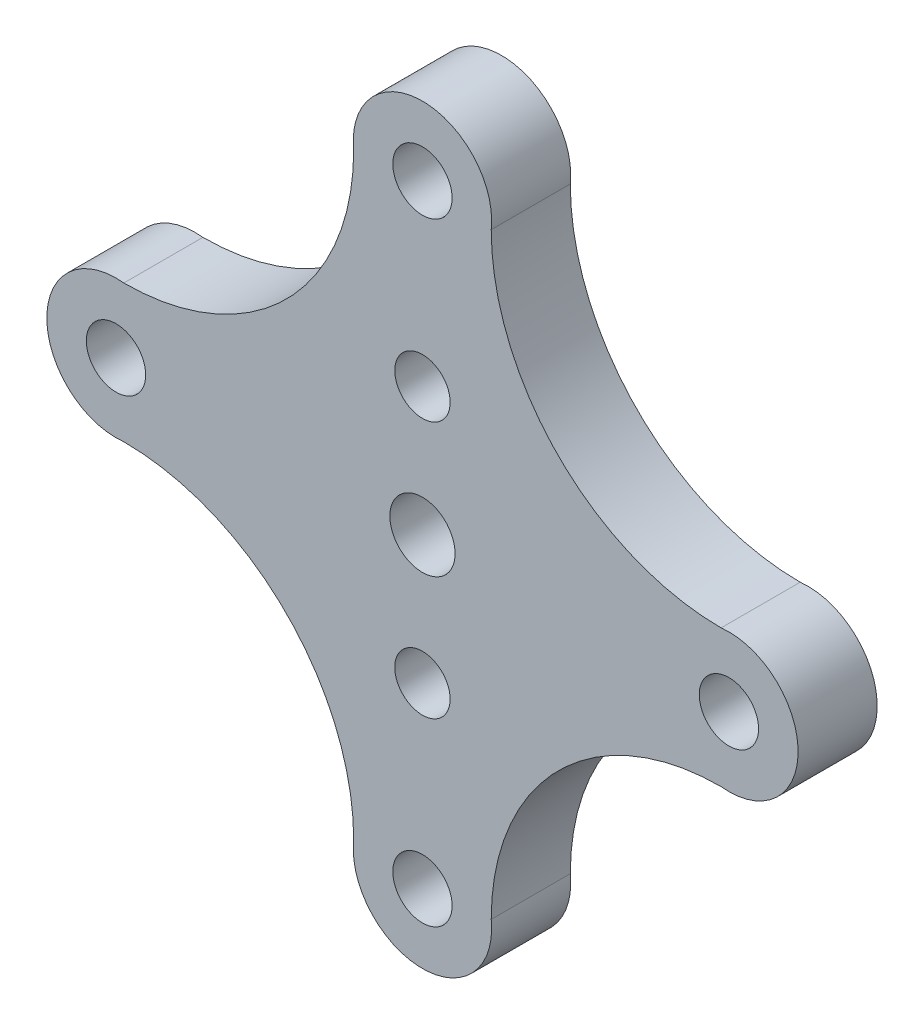
ISO-10303-21;
HEADER;
FILE_DESCRIPTION(('STEP AP214'),'2;1');
FILE_NAME('part.step','',(''),(''),'','','');
FILE_SCHEMA(('AUTOMOTIVE_DESIGN { 1 0 10303 214 1 1 1 1 }'));
ENDSEC;
DATA;
#1=APPLICATION_CONTEXT('core data for automotive mechanical design processes');
#2=APPLICATION_PROTOCOL_DEFINITION('international standard','automotive_design',2000,#1);
#3=PRODUCT_CONTEXT('',#1,'mechanical');
#4=PRODUCT('Part','Part','',(#3));
#5=PRODUCT_RELATED_PRODUCT_CATEGORY('part','',(#4));
#6=PRODUCT_DEFINITION_FORMATION('','',#4);
#7=PRODUCT_DEFINITION_CONTEXT('part definition',#1,'design');
#8=PRODUCT_DEFINITION('design','',#6,#7);
#9=PRODUCT_DEFINITION_SHAPE('','',#8);
#10=(LENGTH_UNIT() NAMED_UNIT(*) SI_UNIT(.MILLI.,.METRE.));
#11=(NAMED_UNIT(*) PLANE_ANGLE_UNIT() SI_UNIT($,.RADIAN.));
#12=(NAMED_UNIT(*) SI_UNIT($,.STERADIAN.) SOLID_ANGLE_UNIT());
#13=UNCERTAINTY_MEASURE_WITH_UNIT(LENGTH_MEASURE(1.E-05),#10,'distance_accuracy_value','');
#14=(GEOMETRIC_REPRESENTATION_CONTEXT(3) GLOBAL_UNCERTAINTY_ASSIGNED_CONTEXT((#13)) GLOBAL_UNIT_ASSIGNED_CONTEXT((#10,
#11,#12)) REPRESENTATION_CONTEXT('',''));
#15=CARTESIAN_POINT('',(0.,0.,0.));
#16=DIRECTION('',(0.,0.,1.));
#17=DIRECTION('',(1.,0.,0.));
#18=AXIS2_PLACEMENT_3D('',#15,#16,#17);
#19=CARTESIAN_POINT('',(-7.55241935483874,-15.3024193548387,4.));
#20=DIRECTION('',(0.,0.,-1.));
#21=DIRECTION('',(-1.,0.,0.));
#22=AXIS2_PLACEMENT_3D('',#19,#20,#21);
#23=PLANE('',#22);
#24=CARTESIAN_POINT('',(-15.1048387096775,-15.1048387096775,4.));
#25=DIRECTION('',(0.,0.,-1.));
#26=DIRECTION('',(-1.,0.,0.));
#27=AXIS2_PLACEMENT_3D('',#24,#25,#26);
#28=CIRCLE('',#27,11.6272177477798);
#29=CARTESIAN_POINT('',(-15.1048387096774,-3.4776209618977,4.));
#30=VERTEX_POINT('',#29);
#31=CARTESIAN_POINT('',(-3.47762096189774,-15.1048387096774,4.));
#32=VERTEX_POINT('',#31);
#33=EDGE_CURVE('E164',#30,#32,#28,.T.);
#34=ORIENTED_EDGE('',*,*,#33,.T.);
#35=CARTESIAN_POINT('',(0.,-15.5,4.));
#36=DIRECTION('',(0.,0.,1.));
#37=DIRECTION('',(1.,0.,0.));
#38=AXIS2_PLACEMENT_3D('',#35,#36,#37);
#39=CIRCLE('',#38,3.5);
#40=CARTESIAN_POINT('',(3.47762096189774,-15.1048387096774,4.));
#41=VERTEX_POINT('',#40);
#42=EDGE_CURVE('E100',#32,#41,#39,.T.);
#43=ORIENTED_EDGE('',*,*,#42,.T.);
#44=CARTESIAN_POINT('',(15.1048387096773,-15.1048387096775,4.));
#45=DIRECTION('',(0.,0.,-1.));
#46=DIRECTION('',(1.,0.,0.));
#47=AXIS2_PLACEMENT_3D('',#44,#45,#46);
#48=CIRCLE('',#47,11.6272177477796);
#49=CARTESIAN_POINT('',(15.1048387096774,-3.4776209618979,4.));
#50=VERTEX_POINT('',#49);
#51=EDGE_CURVE('E185',#41,#50,#48,.T.);
#52=ORIENTED_EDGE('',*,*,#51,.T.);
#53=CARTESIAN_POINT('',(15.5,-1.62353882256206E-13,4.));
#54=DIRECTION('',(0.,0.,1.));
#55=DIRECTION('',(1.,0.,0.));
#56=AXIS2_PLACEMENT_3D('',#53,#54,#55);
#57=CIRCLE('',#56,3.5);
#58=CARTESIAN_POINT('',(15.1048387096775,3.47762096189759,4.));
#59=VERTEX_POINT('',#58);
#60=EDGE_CURVE('E199',#50,#59,#57,.T.);
#61=ORIENTED_EDGE('',*,*,#60,.T.);
#62=CARTESIAN_POINT('',(15.104838709678,15.104838709678,4.));
#63=DIRECTION('',(0.,0.,-1.));
#64=DIRECTION('',(1.,0.,0.));
#65=AXIS2_PLACEMENT_3D('',#62,#63,#64);
#66=CIRCLE('',#65,11.6272177477803);
#67=CARTESIAN_POINT('',(3.47762096189772,15.1048387096777,4.));
#68=VERTEX_POINT('',#67);
#69=EDGE_CURVE('E119',#59,#68,#66,.T.);
#70=ORIENTED_EDGE('',*,*,#69,.T.);
#71=CARTESIAN_POINT('',(0.,15.5000000000002,4.));
#72=DIRECTION('',(0.,0.,1.));
#73=DIRECTION('',(1.,0.,0.));
#74=AXIS2_PLACEMENT_3D('',#71,#72,#73);
#75=CIRCLE('',#74,3.5);
#76=CARTESIAN_POINT('',(-3.47762096189766,15.1048387096777,4.));
#77=VERTEX_POINT('',#76);
#78=EDGE_CURVE('E113',#68,#77,#75,.T.);
#79=ORIENTED_EDGE('',*,*,#78,.T.);
#80=CARTESIAN_POINT('',(-15.1048387096774,15.1048387096776,4.));
#81=DIRECTION('',(0.,0.,-1.));
#82=DIRECTION('',(1.,0.,0.));
#83=AXIS2_PLACEMENT_3D('',#80,#81,#82);
#84=CIRCLE('',#83,11.6272177477798);
#85=CARTESIAN_POINT('',(-15.1048387096774,3.47762096189785,4.));
#86=VERTEX_POINT('',#85);
#87=EDGE_CURVE('E117',#77,#86,#84,.T.);
#88=ORIENTED_EDGE('',*,*,#87,.T.);
#89=CARTESIAN_POINT('',(-15.5,0.,4.));
#90=DIRECTION('',(0.,0.,1.));
#91=DIRECTION('',(1.,0.,0.));
#92=AXIS2_PLACEMENT_3D('',#89,#90,#91);
#93=CIRCLE('',#92,3.5);
#94=EDGE_CURVE('E57',#86,#30,#93,.T.);
#95=ORIENTED_EDGE('',*,*,#94,.T.);
#96=EDGE_LOOP('',(#34,#43,#52,#61,#70,#79,#88,#95));
#97=FACE_BOUND('',#96,.T.);
#98=CARTESIAN_POINT('',(0.,0.,4.));
#99=DIRECTION('',(0.,0.,1.));
#100=DIRECTION('',(1.,0.,0.));
#101=AXIS2_PLACEMENT_3D('',#98,#99,#100);
#102=CIRCLE('',#101,1.65);
#103=CARTESIAN_POINT('',(1.65,0.,4.));
#104=VERTEX_POINT('',#103);
#105=EDGE_CURVE('E146',#104,#104,#102,.T.);
#106=ORIENTED_EDGE('',*,*,#105,.F.);
#107=EDGE_LOOP('',(#106));
#108=FACE_BOUND('',#107,.T.);
#109=CARTESIAN_POINT('',(0.,-6.5,4.));
#110=DIRECTION('',(0.,0.,1.));
#111=DIRECTION('',(1.,0.,0.));
#112=AXIS2_PLACEMENT_3D('',#109,#110,#111);
#113=CIRCLE('',#112,1.4);
#114=CARTESIAN_POINT('',(1.4,-6.5,4.));
#115=VERTEX_POINT('',#114);
#116=EDGE_CURVE('E213',#115,#115,#113,.T.);
#117=ORIENTED_EDGE('',*,*,#116,.F.);
#118=EDGE_LOOP('',(#117));
#119=FACE_BOUND('',#118,.T.);
#120=CARTESIAN_POINT('',(0.,-15.5,4.));
#121=DIRECTION('',(0.,0.,1.));
#122=DIRECTION('',(1.,0.,0.));
#123=AXIS2_PLACEMENT_3D('',#120,#121,#122);
#124=CIRCLE('',#123,1.5);
#125=CARTESIAN_POINT('',(1.5,-15.5,4.));
#126=VERTEX_POINT('',#125);
#127=EDGE_CURVE('E221',#126,#126,#124,.T.);
#128=ORIENTED_EDGE('',*,*,#127,.F.);
#129=EDGE_LOOP('',(#128));
#130=FACE_BOUND('',#129,.T.);
#131=CARTESIAN_POINT('',(0.,6.5,4.));
#132=DIRECTION('',(0.,0.,1.));
#133=DIRECTION('',(1.,0.,0.));
#134=AXIS2_PLACEMENT_3D('',#131,#132,#133);
#135=CIRCLE('',#134,1.4);
#136=CARTESIAN_POINT('',(1.40000000000005,6.5,4.));
#137=VERTEX_POINT('',#136);
#138=EDGE_CURVE('E229',#137,#137,#135,.T.);
#139=ORIENTED_EDGE('',*,*,#138,.F.);
#140=EDGE_LOOP('',(#139));
#141=FACE_BOUND('',#140,.T.);
#142=CARTESIAN_POINT('',(-15.5,0.,4.));
#143=DIRECTION('',(0.,0.,1.));
#144=DIRECTION('',(1.,0.,0.));
#145=AXIS2_PLACEMENT_3D('',#142,#143,#144);
#146=CIRCLE('',#145,1.5);
#147=CARTESIAN_POINT('',(-14.,0.,4.));
#148=VERTEX_POINT('',#147);
#149=EDGE_CURVE('E237',#148,#148,#146,.T.);
#150=ORIENTED_EDGE('',*,*,#149,.F.);
#151=EDGE_LOOP('',(#150));
#152=FACE_BOUND('',#151,.T.);
#153=CARTESIAN_POINT('',(1.08235921504137E-13,15.5,4.));
#154=DIRECTION('',(0.,0.,1.));
#155=DIRECTION('',(1.,0.,0.));
#156=AXIS2_PLACEMENT_3D('',#153,#154,#155);
#157=CIRCLE('',#156,1.5);
#158=CARTESIAN_POINT('',(1.50000000000011,15.5,4.));
#159=VERTEX_POINT('',#158);
#160=EDGE_CURVE('E245',#159,#159,#157,.T.);
#161=ORIENTED_EDGE('',*,*,#160,.F.);
#162=EDGE_LOOP('',(#161));
#163=FACE_BOUND('',#162,.T.);
#164=CARTESIAN_POINT('',(15.5,-1.62353882256206E-13,4.));
#165=DIRECTION('',(0.,0.,1.));
#166=DIRECTION('',(1.,0.,0.));
#167=AXIS2_PLACEMENT_3D('',#164,#165,#166);
#168=CIRCLE('',#167,1.5);
#169=CARTESIAN_POINT('',(17.,-1.62353882256206E-13,4.));
#170=VERTEX_POINT('',#169);
#171=EDGE_CURVE('E253',#170,#170,#168,.T.);
#172=ORIENTED_EDGE('',*,*,#171,.F.);
#173=EDGE_LOOP('',(#172));
#174=FACE_BOUND('',#173,.T.);
#175=ADVANCED_FACE('F39',(#97,#108,#119,#130,#141,#152,#163,#174),#23,.F.);
#176=CARTESIAN_POINT('',(-7.55241935483874,-15.3024193548387,0.));
#177=DIRECTION('',(0.,0.,-1.));
#178=DIRECTION('',(-1.,0.,0.));
#179=AXIS2_PLACEMENT_3D('',#176,#177,#178);
#180=PLANE('',#179);
#181=CARTESIAN_POINT('',(1.08235921504137E-13,15.5,0.));
#182=DIRECTION('',(0.,0.,1.));
#183=DIRECTION('',(1.,0.,0.));
#184=AXIS2_PLACEMENT_3D('',#181,#182,#183);
#185=CIRCLE('',#184,1.5);
#186=CARTESIAN_POINT('',(1.50000000000011,15.5,0.));
#187=VERTEX_POINT('',#186);
#188=EDGE_CURVE('E249',#187,#187,#185,.T.);
#189=ORIENTED_EDGE('',*,*,#188,.T.);
#190=EDGE_LOOP('',(#189));
#191=FACE_BOUND('',#190,.T.);
#192=CARTESIAN_POINT('',(0.,6.5,0.));
#193=DIRECTION('',(0.,0.,1.));
#194=DIRECTION('',(1.,0.,0.));
#195=AXIS2_PLACEMENT_3D('',#192,#193,#194);
#196=CIRCLE('',#195,1.4);
#197=CARTESIAN_POINT('',(1.40000000000005,6.5,0.));
#198=VERTEX_POINT('',#197);
#199=EDGE_CURVE('E233',#198,#198,#196,.T.);
#200=ORIENTED_EDGE('',*,*,#199,.T.);
#201=EDGE_LOOP('',(#200));
#202=FACE_BOUND('',#201,.T.);
#203=CARTESIAN_POINT('',(0.,-6.5,0.));
#204=DIRECTION('',(0.,0.,1.));
#205=DIRECTION('',(1.,0.,0.));
#206=AXIS2_PLACEMENT_3D('',#203,#204,#205);
#207=CIRCLE('',#206,1.4);
#208=CARTESIAN_POINT('',(1.4,-6.5,0.));
#209=VERTEX_POINT('',#208);
#210=EDGE_CURVE('E217',#209,#209,#207,.T.);
#211=ORIENTED_EDGE('',*,*,#210,.T.);
#212=EDGE_LOOP('',(#211));
#213=FACE_BOUND('',#212,.T.);
#214=CARTESIAN_POINT('',(-15.1048387096775,-15.1048387096775,0.));
#215=DIRECTION('',(0.,0.,-1.));
#216=DIRECTION('',(-1.,0.,0.));
#217=AXIS2_PLACEMENT_3D('',#214,#215,#216);
#218=CIRCLE('',#217,11.6272177477798);
#219=CARTESIAN_POINT('',(-15.1048387096774,-3.4776209618977,0.));
#220=VERTEX_POINT('',#219);
#221=CARTESIAN_POINT('',(-3.47762096189774,-15.1048387096774,0.));
#222=VERTEX_POINT('',#221);
#223=EDGE_CURVE('E141',#220,#222,#218,.T.);
#224=ORIENTED_EDGE('',*,*,#223,.F.);
#225=CARTESIAN_POINT('',(-15.5,0.,0.));
#226=DIRECTION('',(0.,0.,1.));
#227=DIRECTION('',(1.,0.,0.));
#228=AXIS2_PLACEMENT_3D('',#225,#226,#227);
#229=CIRCLE('',#228,3.5);
#230=CARTESIAN_POINT('',(-15.1048387096774,3.47762096189785,0.));
#231=VERTEX_POINT('',#230);
#232=EDGE_CURVE('E92',#231,#220,#229,.T.);
#233=ORIENTED_EDGE('',*,*,#232,.F.);
#234=CARTESIAN_POINT('',(-15.1048387096774,15.1048387096776,0.));
#235=DIRECTION('',(0.,0.,-1.));
#236=DIRECTION('',(1.,0.,0.));
#237=AXIS2_PLACEMENT_3D('',#234,#235,#236);
#238=CIRCLE('',#237,11.6272177477798);
#239=CARTESIAN_POINT('',(-3.47762096189766,15.1048387096777,0.));
#240=VERTEX_POINT('',#239);
#241=EDGE_CURVE('E86',#240,#231,#238,.T.);
#242=ORIENTED_EDGE('',*,*,#241,.F.);
#243=CARTESIAN_POINT('',(0.,15.5000000000002,0.));
#244=DIRECTION('',(0.,0.,1.));
#245=DIRECTION('',(1.,0.,0.));
#246=AXIS2_PLACEMENT_3D('',#243,#244,#245);
#247=CIRCLE('',#246,3.5);
#248=CARTESIAN_POINT('',(3.47762096189772,15.1048387096777,0.));
#249=VERTEX_POINT('',#248);
#250=EDGE_CURVE('E128',#249,#240,#247,.T.);
#251=ORIENTED_EDGE('',*,*,#250,.F.);
#252=CARTESIAN_POINT('',(15.104838709678,15.104838709678,0.));
#253=DIRECTION('',(0.,0.,-1.));
#254=DIRECTION('',(1.,0.,0.));
#255=AXIS2_PLACEMENT_3D('',#252,#253,#254);
#256=CIRCLE('',#255,11.6272177477803);
#257=CARTESIAN_POINT('',(15.1048387096775,3.47762096189759,0.));
#258=VERTEX_POINT('',#257);
#259=EDGE_CURVE('E155',#258,#249,#256,.T.);
#260=ORIENTED_EDGE('',*,*,#259,.F.);
#261=CARTESIAN_POINT('',(15.5,-1.62353882256206E-13,0.));
#262=DIRECTION('',(0.,0.,1.));
#263=DIRECTION('',(1.,0.,0.));
#264=AXIS2_PLACEMENT_3D('',#261,#262,#263);
#265=CIRCLE('',#264,3.5);
#266=CARTESIAN_POINT('',(15.1048387096774,-3.4776209618979,0.));
#267=VERTEX_POINT('',#266);
#268=EDGE_CURVE('E152',#267,#258,#265,.T.);
#269=ORIENTED_EDGE('',*,*,#268,.F.);
#270=CARTESIAN_POINT('',(15.1048387096773,-15.1048387096775,0.));
#271=DIRECTION('',(0.,0.,-1.));
#272=DIRECTION('',(1.,0.,0.));
#273=AXIS2_PLACEMENT_3D('',#270,#271,#272);
#274=CIRCLE('',#273,11.6272177477796);
#275=CARTESIAN_POINT('',(3.47762096189774,-15.1048387096774,0.));
#276=VERTEX_POINT('',#275);
#277=EDGE_CURVE('E149',#276,#267,#274,.T.);
#278=ORIENTED_EDGE('',*,*,#277,.F.);
#279=CARTESIAN_POINT('',(0.,-15.5,0.));
#280=DIRECTION('',(0.,0.,1.));
#281=DIRECTION('',(1.,0.,0.));
#282=AXIS2_PLACEMENT_3D('',#279,#280,#281);
#283=CIRCLE('',#282,3.5);
#284=EDGE_CURVE('E145',#222,#276,#283,.T.);
#285=ORIENTED_EDGE('',*,*,#284,.F.);
#286=EDGE_LOOP('',(#224,#233,#242,#251,#260,#269,#278,#285));
#287=FACE_BOUND('',#286,.T.);
#288=CARTESIAN_POINT('',(0.,0.,0.));
#289=DIRECTION('',(0.,0.,1.));
#290=DIRECTION('',(1.,0.,0.));
#291=AXIS2_PLACEMENT_3D('',#288,#289,#290);
#292=CIRCLE('',#291,1.65);
#293=CARTESIAN_POINT('',(1.65,0.,0.));
#294=VERTEX_POINT('',#293);
#295=EDGE_CURVE('E209',#294,#294,#292,.T.);
#296=ORIENTED_EDGE('',*,*,#295,.T.);
#297=EDGE_LOOP('',(#296));
#298=FACE_BOUND('',#297,.T.);
#299=CARTESIAN_POINT('',(0.,-15.5,0.));
#300=DIRECTION('',(0.,0.,1.));
#301=DIRECTION('',(1.,0.,0.));
#302=AXIS2_PLACEMENT_3D('',#299,#300,#301);
#303=CIRCLE('',#302,1.5);
#304=CARTESIAN_POINT('',(1.5,-15.5,0.));
#305=VERTEX_POINT('',#304);
#306=EDGE_CURVE('E225',#305,#305,#303,.T.);
#307=ORIENTED_EDGE('',*,*,#306,.T.);
#308=EDGE_LOOP('',(#307));
#309=FACE_BOUND('',#308,.T.);
#310=CARTESIAN_POINT('',(-15.5,0.,0.));
#311=DIRECTION('',(0.,0.,1.));
#312=DIRECTION('',(1.,0.,0.));
#313=AXIS2_PLACEMENT_3D('',#310,#311,#312);
#314=CIRCLE('',#313,1.5);
#315=CARTESIAN_POINT('',(-14.,0.,0.));
#316=VERTEX_POINT('',#315);
#317=EDGE_CURVE('E241',#316,#316,#314,.T.);
#318=ORIENTED_EDGE('',*,*,#317,.T.);
#319=EDGE_LOOP('',(#318));
#320=FACE_BOUND('',#319,.T.);
#321=CARTESIAN_POINT('',(15.5,-1.62353882256206E-13,0.));
#322=DIRECTION('',(0.,0.,1.));
#323=DIRECTION('',(1.,0.,0.));
#324=AXIS2_PLACEMENT_3D('',#321,#322,#323);
#325=CIRCLE('',#324,1.5);
#326=CARTESIAN_POINT('',(17.,-1.62353882256206E-13,0.));
#327=VERTEX_POINT('',#326);
#328=EDGE_CURVE('E257',#327,#327,#325,.T.);
#329=ORIENTED_EDGE('',*,*,#328,.T.);
#330=EDGE_LOOP('',(#329));
#331=FACE_BOUND('',#330,.T.);
#332=ADVANCED_FACE('F189',(#191,#202,#213,#287,#298,#309,#320,#331),#180,.T.);
#333=CARTESIAN_POINT('',(-15.1048387096775,-15.1048387096775,4.));
#334=DIRECTION('',(0.,0.,-1.));
#335=DIRECTION('',(-1.,0.,0.));
#336=AXIS2_PLACEMENT_3D('',#333,#334,#335);
#337=CYLINDRICAL_SURFACE('',#336,11.6272177477798);
#338=ORIENTED_EDGE('',*,*,#223,.T.);
#339=DIRECTION('',(0.,0.,-1.));
#340=VECTOR('',#339,1.);
#341=CARTESIAN_POINT('',(-3.47762096189774,-15.1048387096774,4.));
#342=LINE('',#341,#340);
#343=EDGE_CURVE('E11',#32,#222,#342,.T.);
#344=ORIENTED_EDGE('',*,*,#343,.F.);
#345=ORIENTED_EDGE('',*,*,#33,.F.);
#346=DIRECTION('',(0.,0.,-1.));
#347=VECTOR('',#346,1.);
#348=CARTESIAN_POINT('',(-15.1048387096774,-3.4776209618977,4.));
#349=LINE('',#348,#347);
#350=EDGE_CURVE('E137',#30,#220,#349,.T.);
#351=ORIENTED_EDGE('',*,*,#350,.T.);
#352=EDGE_LOOP('',(#338,#344,#345,#351));
#353=FACE_BOUND('',#352,.T.);
#354=ADVANCED_FACE('F41',(#353),#337,.F.);
#355=CARTESIAN_POINT('',(0.,-15.5,4.));
#356=DIRECTION('',(0.,0.,-1.));
#357=DIRECTION('',(-1.,0.,0.));
#358=AXIS2_PLACEMENT_3D('',#355,#356,#357);
#359=CYLINDRICAL_SURFACE('',#358,3.5);
#360=ORIENTED_EDGE('',*,*,#284,.T.);
#361=DIRECTION('',(0.,0.,-1.));
#362=VECTOR('',#361,1.);
#363=CARTESIAN_POINT('',(3.47762096189774,-15.1048387096774,4.));
#364=LINE('',#363,#362);
#365=EDGE_CURVE('E49',#41,#276,#364,.T.);
#366=ORIENTED_EDGE('',*,*,#365,.F.);
#367=ORIENTED_EDGE('',*,*,#42,.F.);
#368=ORIENTED_EDGE('',*,*,#343,.T.);
#369=EDGE_LOOP('',(#360,#366,#367,#368));
#370=FACE_BOUND('',#369,.T.);
#371=ADVANCED_FACE('F291',(#370),#359,.T.);
#372=CARTESIAN_POINT('',(15.1048387096773,-15.1048387096775,4.));
#373=DIRECTION('',(0.,0.,-1.));
#374=DIRECTION('',(-1.,0.,0.));
#375=AXIS2_PLACEMENT_3D('',#372,#373,#374);
#376=CYLINDRICAL_SURFACE('',#375,11.6272177477796);
#377=ORIENTED_EDGE('',*,*,#277,.T.);
#378=DIRECTION('',(0.,0.,-1.));
#379=VECTOR('',#378,1.);
#380=CARTESIAN_POINT('',(15.1048387096774,-3.4776209618979,4.));
#381=LINE('',#380,#379);
#382=EDGE_CURVE('E175',#50,#267,#381,.T.);
#383=ORIENTED_EDGE('',*,*,#382,.F.);
#384=ORIENTED_EDGE('',*,*,#51,.F.);
#385=ORIENTED_EDGE('',*,*,#365,.T.);
#386=EDGE_LOOP('',(#377,#383,#384,#385));
#387=FACE_BOUND('',#386,.T.);
#388=ADVANCED_FACE('F183',(#387),#376,.F.);
#389=CARTESIAN_POINT('',(15.5,-1.62353882256206E-13,4.));
#390=DIRECTION('',(0.,0.,-1.));
#391=DIRECTION('',(-1.,0.,0.));
#392=AXIS2_PLACEMENT_3D('',#389,#390,#391);
#393=CYLINDRICAL_SURFACE('',#392,3.5);
#394=ORIENTED_EDGE('',*,*,#268,.T.);
#395=DIRECTION('',(0.,0.,-1.));
#396=VECTOR('',#395,1.);
#397=CARTESIAN_POINT('',(15.1048387096775,3.47762096189759,4.));
#398=LINE('',#397,#396);
#399=EDGE_CURVE('E171',#59,#258,#398,.T.);
#400=ORIENTED_EDGE('',*,*,#399,.F.);
#401=ORIENTED_EDGE('',*,*,#60,.F.);
#402=ORIENTED_EDGE('',*,*,#382,.T.);
#403=EDGE_LOOP('',(#394,#400,#401,#402));
#404=FACE_BOUND('',#403,.T.);
#405=ADVANCED_FACE('F194',(#404),#393,.T.);
#406=CARTESIAN_POINT('',(15.104838709678,15.104838709678,4.));
#407=DIRECTION('',(0.,0.,-1.));
#408=DIRECTION('',(-1.,0.,0.));
#409=AXIS2_PLACEMENT_3D('',#406,#407,#408);
#410=CYLINDRICAL_SURFACE('',#409,11.6272177477803);
#411=ORIENTED_EDGE('',*,*,#259,.T.);
#412=DIRECTION('',(0.,0.,-1.));
#413=VECTOR('',#412,1.);
#414=CARTESIAN_POINT('',(3.47762096189772,15.1048387096777,4.));
#415=LINE('',#414,#413);
#416=EDGE_CURVE('E130',#68,#249,#415,.T.);
#417=ORIENTED_EDGE('',*,*,#416,.F.);
#418=ORIENTED_EDGE('',*,*,#69,.F.);
#419=ORIENTED_EDGE('',*,*,#399,.T.);
#420=EDGE_LOOP('',(#411,#417,#418,#419));
#421=FACE_BOUND('',#420,.T.);
#422=ADVANCED_FACE('F197',(#421),#410,.F.);
#423=CARTESIAN_POINT('',(0.,15.5000000000002,4.));
#424=DIRECTION('',(0.,0.,-1.));
#425=DIRECTION('',(-1.,0.,0.));
#426=AXIS2_PLACEMENT_3D('',#423,#424,#425);
#427=CYLINDRICAL_SURFACE('',#426,3.5);
#428=ORIENTED_EDGE('',*,*,#250,.T.);
#429=DIRECTION('',(0.,0.,-1.));
#430=VECTOR('',#429,1.);
#431=CARTESIAN_POINT('',(-3.47762096189766,15.1048387096777,4.));
#432=LINE('',#431,#430);
#433=EDGE_CURVE('E125',#77,#240,#432,.T.);
#434=ORIENTED_EDGE('',*,*,#433,.F.);
#435=ORIENTED_EDGE('',*,*,#78,.F.);
#436=ORIENTED_EDGE('',*,*,#416,.T.);
#437=EDGE_LOOP('',(#428,#434,#435,#436));
#438=FACE_BOUND('',#437,.T.);
#439=ADVANCED_FACE('F126',(#438),#427,.T.);
#440=CARTESIAN_POINT('',(-15.1048387096774,15.1048387096776,4.));
#441=DIRECTION('',(0.,0.,-1.));
#442=DIRECTION('',(-1.,0.,0.));
#443=AXIS2_PLACEMENT_3D('',#440,#441,#442);
#444=CYLINDRICAL_SURFACE('',#443,11.6272177477798);
#445=ORIENTED_EDGE('',*,*,#241,.T.);
#446=DIRECTION('',(0.,0.,-1.));
#447=VECTOR('',#446,1.);
#448=CARTESIAN_POINT('',(-15.1048387096774,3.47762096189785,4.));
#449=LINE('',#448,#447);
#450=EDGE_CURVE('E131',#86,#231,#449,.T.);
#451=ORIENTED_EDGE('',*,*,#450,.F.);
#452=ORIENTED_EDGE('',*,*,#87,.F.);
#453=ORIENTED_EDGE('',*,*,#433,.T.);
#454=EDGE_LOOP('',(#445,#451,#452,#453));
#455=FACE_BOUND('',#454,.T.);
#456=ADVANCED_FACE('F133',(#455),#444,.F.);
#457=CARTESIAN_POINT('',(-15.5,0.,4.));
#458=DIRECTION('',(0.,0.,-1.));
#459=DIRECTION('',(-1.,0.,0.));
#460=AXIS2_PLACEMENT_3D('',#457,#458,#459);
#461=CYLINDRICAL_SURFACE('',#460,3.5);
#462=ORIENTED_EDGE('',*,*,#232,.T.);
#463=ORIENTED_EDGE('',*,*,#350,.F.);
#464=ORIENTED_EDGE('',*,*,#94,.F.);
#465=ORIENTED_EDGE('',*,*,#450,.T.);
#466=EDGE_LOOP('',(#462,#463,#464,#465));
#467=FACE_BOUND('',#466,.T.);
#468=ADVANCED_FACE('F279',(#467),#461,.T.);
#469=CARTESIAN_POINT('',(0.,0.,4.));
#470=DIRECTION('',(0.,0.,-1.));
#471=DIRECTION('',(-1.,0.,0.));
#472=AXIS2_PLACEMENT_3D('',#469,#470,#471);
#473=CYLINDRICAL_SURFACE('',#472,1.65);
#474=ORIENTED_EDGE('',*,*,#105,.T.);
#475=EDGE_LOOP('',(#474));
#476=FACE_BOUND('',#475,.T.);
#477=ORIENTED_EDGE('',*,*,#295,.F.);
#478=EDGE_LOOP('',(#477));
#479=FACE_BOUND('',#478,.T.);
#480=ADVANCED_FACE('F276',(#476,#479),#473,.F.);
#481=CARTESIAN_POINT('',(0.,-6.5,4.));
#482=DIRECTION('',(0.,0.,-1.));
#483=DIRECTION('',(-1.,0.,0.));
#484=AXIS2_PLACEMENT_3D('',#481,#482,#483);
#485=CYLINDRICAL_SURFACE('',#484,1.4);
#486=ORIENTED_EDGE('',*,*,#116,.T.);
#487=EDGE_LOOP('',(#486));
#488=FACE_BOUND('',#487,.T.);
#489=ORIENTED_EDGE('',*,*,#210,.F.);
#490=EDGE_LOOP('',(#489));
#491=FACE_BOUND('',#490,.T.);
#492=ADVANCED_FACE('F355',(#488,#491),#485,.F.);
#493=CARTESIAN_POINT('',(0.,-15.5,4.));
#494=DIRECTION('',(0.,0.,-1.));
#495=DIRECTION('',(-1.,0.,0.));
#496=AXIS2_PLACEMENT_3D('',#493,#494,#495);
#497=CYLINDRICAL_SURFACE('',#496,1.5);
#498=ORIENTED_EDGE('',*,*,#127,.T.);
#499=EDGE_LOOP('',(#498));
#500=FACE_BOUND('',#499,.T.);
#501=ORIENTED_EDGE('',*,*,#306,.F.);
#502=EDGE_LOOP('',(#501));
#503=FACE_BOUND('',#502,.T.);
#504=ADVANCED_FACE('F363',(#500,#503),#497,.F.);
#505=CARTESIAN_POINT('',(0.,6.5,4.));
#506=DIRECTION('',(0.,0.,-1.));
#507=DIRECTION('',(-1.,0.,0.));
#508=AXIS2_PLACEMENT_3D('',#505,#506,#507);
#509=CYLINDRICAL_SURFACE('',#508,1.4);
#510=ORIENTED_EDGE('',*,*,#138,.T.);
#511=EDGE_LOOP('',(#510));
#512=FACE_BOUND('',#511,.T.);
#513=ORIENTED_EDGE('',*,*,#199,.F.);
#514=EDGE_LOOP('',(#513));
#515=FACE_BOUND('',#514,.T.);
#516=ADVANCED_FACE('F371',(#512,#515),#509,.F.);
#517=CARTESIAN_POINT('',(-15.5,0.,4.));
#518=DIRECTION('',(0.,0.,-1.));
#519=DIRECTION('',(-1.,0.,0.));
#520=AXIS2_PLACEMENT_3D('',#517,#518,#519);
#521=CYLINDRICAL_SURFACE('',#520,1.5);
#522=ORIENTED_EDGE('',*,*,#149,.T.);
#523=EDGE_LOOP('',(#522));
#524=FACE_BOUND('',#523,.T.);
#525=ORIENTED_EDGE('',*,*,#317,.F.);
#526=EDGE_LOOP('',(#525));
#527=FACE_BOUND('',#526,.T.);
#528=ADVANCED_FACE('F380',(#524,#527),#521,.F.);
#529=CARTESIAN_POINT('',(1.08235921504137E-13,15.5,4.));
#530=DIRECTION('',(0.,0.,-1.));
#531=DIRECTION('',(-1.,0.,0.));
#532=AXIS2_PLACEMENT_3D('',#529,#530,#531);
#533=CYLINDRICAL_SURFACE('',#532,1.5);
#534=ORIENTED_EDGE('',*,*,#160,.T.);
#535=EDGE_LOOP('',(#534));
#536=FACE_BOUND('',#535,.T.);
#537=ORIENTED_EDGE('',*,*,#188,.F.);
#538=EDGE_LOOP('',(#537));
#539=FACE_BOUND('',#538,.T.);
#540=ADVANCED_FACE('F389',(#536,#539),#533,.F.);
#541=CARTESIAN_POINT('',(15.5,-1.62353882256206E-13,4.));
#542=DIRECTION('',(0.,0.,-1.));
#543=DIRECTION('',(-1.,0.,0.));
#544=AXIS2_PLACEMENT_3D('',#541,#542,#543);
#545=CYLINDRICAL_SURFACE('',#544,1.5);
#546=ORIENTED_EDGE('',*,*,#171,.T.);
#547=EDGE_LOOP('',(#546));
#548=FACE_BOUND('',#547,.T.);
#549=ORIENTED_EDGE('',*,*,#328,.F.);
#550=EDGE_LOOP('',(#549));
#551=FACE_BOUND('',#550,.T.);
#552=ADVANCED_FACE('F265',(#548,#551),#545,.F.);
#553=CLOSED_SHELL('',(#175,#332,#354,#371,#388,#405,#422,#439,#456,#468,#480,#492,#504,#516,
#528,#540,#552));
#554=MANIFOLD_SOLID_BREP('B2',#553);
#555=ADVANCED_BREP_SHAPE_REPRESENTATION('',(#18,#554),#14);
#556=SHAPE_DEFINITION_REPRESENTATION(#9,#555);
ENDSEC;
END-ISO-10303-21;
